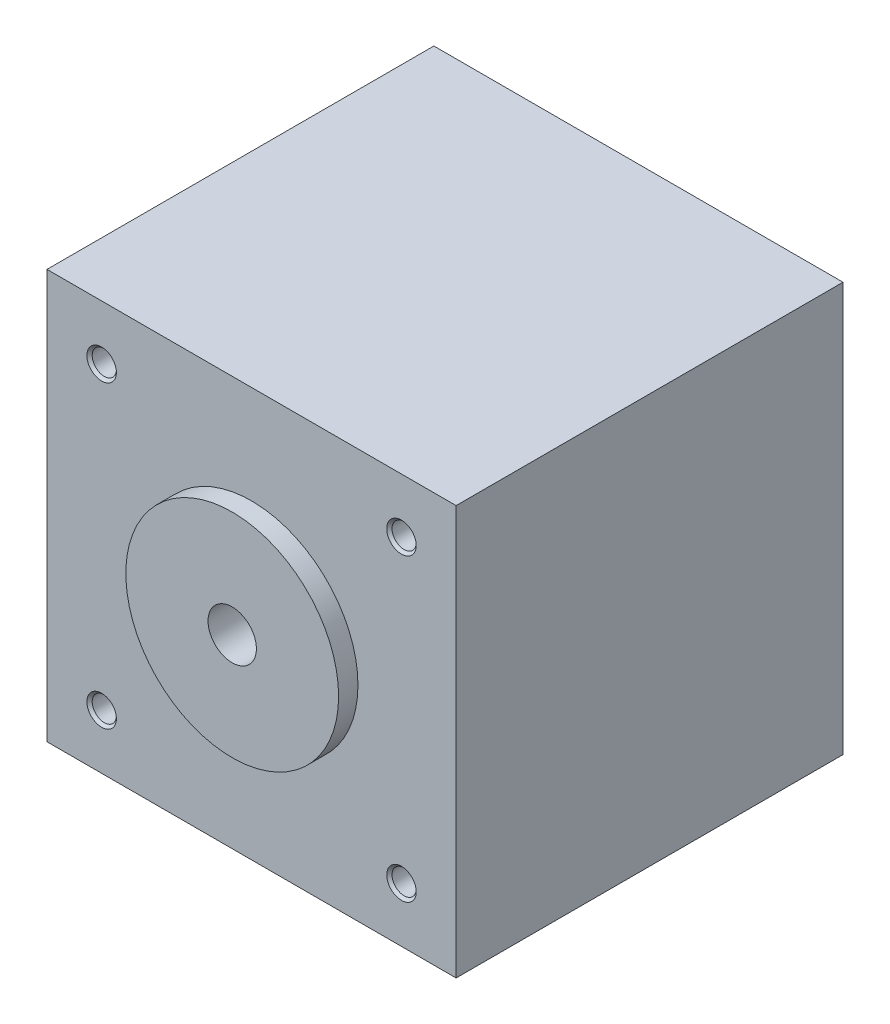
ISO-10303-21;
HEADER;
FILE_DESCRIPTION(('STEP AP214'),'2;1');
FILE_NAME('part.step','',(''),(''),'','','');
FILE_SCHEMA(('AUTOMOTIVE_DESIGN { 1 0 10303 214 1 1 1 1 }'));
ENDSEC;
DATA;
#1=APPLICATION_CONTEXT('core data for automotive mechanical design processes');
#2=APPLICATION_PROTOCOL_DEFINITION('international standard','automotive_design',2000,#1);
#3=PRODUCT_CONTEXT('',#1,'mechanical');
#4=PRODUCT('Part','Part','',(#3));
#5=PRODUCT_RELATED_PRODUCT_CATEGORY('part','',(#4));
#6=PRODUCT_DEFINITION_FORMATION('','',#4);
#7=PRODUCT_DEFINITION_CONTEXT('part definition',#1,'design');
#8=PRODUCT_DEFINITION('design','',#6,#7);
#9=PRODUCT_DEFINITION_SHAPE('','',#8);
#10=(LENGTH_UNIT() NAMED_UNIT(*) SI_UNIT(.MILLI.,.METRE.));
#11=(NAMED_UNIT(*) PLANE_ANGLE_UNIT() SI_UNIT($,.RADIAN.));
#12=(NAMED_UNIT(*) SI_UNIT($,.STERADIAN.) SOLID_ANGLE_UNIT());
#13=UNCERTAINTY_MEASURE_WITH_UNIT(LENGTH_MEASURE(1.E-05),#10,'distance_accuracy_value','');
#14=(GEOMETRIC_REPRESENTATION_CONTEXT(3) GLOBAL_UNCERTAINTY_ASSIGNED_CONTEXT((#13)) GLOBAL_UNIT_ASSIGNED_CONTEXT((#10,
#11,#12)) REPRESENTATION_CONTEXT('',''));
#15=CARTESIAN_POINT('',(0.,0.,0.));
#16=DIRECTION('',(0.,0.,1.));
#17=DIRECTION('',(1.,0.,0.));
#18=AXIS2_PLACEMENT_3D('',#15,#16,#17);
#19=CARTESIAN_POINT('',(21.15,21.15,40.));
#20=DIRECTION('',(-1.,0.,0.));
#21=DIRECTION('',(0.,-1.,0.));
#22=AXIS2_PLACEMENT_3D('',#19,#20,#21);
#23=PLANE('',#22);
#24=DIRECTION('',(0.,1.,0.));
#25=VECTOR('',#24,1.);
#26=CARTESIAN_POINT('',(21.15,21.15,0.));
#27=LINE('',#26,#25);
#28=CARTESIAN_POINT('',(21.15,-21.15,0.));
#29=VERTEX_POINT('',#28);
#30=CARTESIAN_POINT('',(21.15,21.15,0.));
#31=VERTEX_POINT('',#30);
#32=EDGE_CURVE('E165',#29,#31,#27,.T.);
#33=ORIENTED_EDGE('',*,*,#32,.T.);
#34=DIRECTION('',(0.,0.,-1.));
#35=VECTOR('',#34,1.);
#36=CARTESIAN_POINT('',(21.15,21.15,40.));
#37=LINE('',#36,#35);
#38=CARTESIAN_POINT('',(21.15,21.15,40.));
#39=VERTEX_POINT('',#38);
#40=EDGE_CURVE('E11',#39,#31,#37,.T.);
#41=ORIENTED_EDGE('',*,*,#40,.F.);
#42=DIRECTION('',(0.,1.,0.));
#43=VECTOR('',#42,1.);
#44=CARTESIAN_POINT('',(21.15,21.15,40.));
#45=LINE('',#44,#43);
#46=CARTESIAN_POINT('',(21.15,-21.15,40.));
#47=VERTEX_POINT('',#46);
#48=EDGE_CURVE('E166',#47,#39,#45,.T.);
#49=ORIENTED_EDGE('',*,*,#48,.F.);
#50=DIRECTION('',(0.,0.,-1.));
#51=VECTOR('',#50,1.);
#52=CARTESIAN_POINT('',(21.15,-21.15,40.));
#53=LINE('',#52,#51);
#54=EDGE_CURVE('E176',#47,#29,#53,.T.);
#55=ORIENTED_EDGE('',*,*,#54,.T.);
#56=EDGE_LOOP('',(#33,#41,#49,#55));
#57=FACE_BOUND('',#56,.T.);
#58=ADVANCED_FACE('F49',(#57),#23,.F.);
#59=CARTESIAN_POINT('',(-21.15,21.15,40.));
#60=DIRECTION('',(0.,-1.,0.));
#61=DIRECTION('',(0.,0.,-1.));
#62=AXIS2_PLACEMENT_3D('',#59,#60,#61);
#63=PLANE('',#62);
#64=DIRECTION('',(-1.,0.,0.));
#65=VECTOR('',#64,1.);
#66=CARTESIAN_POINT('',(-21.15,21.15,0.));
#67=LINE('',#66,#65);
#68=CARTESIAN_POINT('',(-21.15,21.15,0.));
#69=VERTEX_POINT('',#68);
#70=EDGE_CURVE('E180',#31,#69,#67,.T.);
#71=ORIENTED_EDGE('',*,*,#70,.T.);
#72=DIRECTION('',(0.,0.,-1.));
#73=VECTOR('',#72,1.);
#74=CARTESIAN_POINT('',(-21.15,21.15,40.));
#75=LINE('',#74,#73);
#76=CARTESIAN_POINT('',(-21.15,21.15,40.));
#77=VERTEX_POINT('',#76);
#78=EDGE_CURVE('E58',#77,#69,#75,.T.);
#79=ORIENTED_EDGE('',*,*,#78,.F.);
#80=DIRECTION('',(-1.,0.,0.));
#81=VECTOR('',#80,1.);
#82=CARTESIAN_POINT('',(-21.15,21.15,40.));
#83=LINE('',#82,#81);
#84=EDGE_CURVE('E97',#39,#77,#83,.T.);
#85=ORIENTED_EDGE('',*,*,#84,.F.);
#86=ORIENTED_EDGE('',*,*,#40,.T.);
#87=EDGE_LOOP('',(#71,#79,#85,#86));
#88=FACE_BOUND('',#87,.T.);
#89=ADVANCED_FACE('F210',(#88),#63,.F.);
#90=CARTESIAN_POINT('',(-21.15,21.15,40.));
#91=DIRECTION('',(1.,0.,0.));
#92=DIRECTION('',(0.,1.,0.));
#93=AXIS2_PLACEMENT_3D('',#90,#91,#92);
#94=PLANE('',#93);
#95=DIRECTION('',(0.,-1.,0.));
#96=VECTOR('',#95,1.);
#97=CARTESIAN_POINT('',(-21.15,21.15,0.));
#98=LINE('',#97,#96);
#99=CARTESIAN_POINT('',(-21.15,-21.15,0.));
#100=VERTEX_POINT('',#99);
#101=EDGE_CURVE('E84',#69,#100,#98,.T.);
#102=ORIENTED_EDGE('',*,*,#101,.T.);
#103=DIRECTION('',(0.,0.,-1.));
#104=VECTOR('',#103,1.);
#105=CARTESIAN_POINT('',(-21.15,-21.15,40.));
#106=LINE('',#105,#104);
#107=CARTESIAN_POINT('',(-21.15,-21.15,40.));
#108=VERTEX_POINT('',#107);
#109=EDGE_CURVE('E189',#108,#100,#106,.T.);
#110=ORIENTED_EDGE('',*,*,#109,.F.);
#111=DIRECTION('',(0.,-1.,0.));
#112=VECTOR('',#111,1.);
#113=CARTESIAN_POINT('',(-21.15,21.15,40.));
#114=LINE('',#113,#112);
#115=EDGE_CURVE('E171',#77,#108,#114,.T.);
#116=ORIENTED_EDGE('',*,*,#115,.F.);
#117=ORIENTED_EDGE('',*,*,#78,.T.);
#118=EDGE_LOOP('',(#102,#110,#116,#117));
#119=FACE_BOUND('',#118,.T.);
#120=ADVANCED_FACE('F193',(#119),#94,.F.);
#121=CARTESIAN_POINT('',(-21.15,-21.15,40.));
#122=DIRECTION('',(0.,1.,0.));
#123=DIRECTION('',(0.,0.,1.));
#124=AXIS2_PLACEMENT_3D('',#121,#122,#123);
#125=PLANE('',#124);
#126=DIRECTION('',(1.,0.,0.));
#127=VECTOR('',#126,1.);
#128=CARTESIAN_POINT('',(-21.15,-21.15,0.));
#129=LINE('',#128,#127);
#130=EDGE_CURVE('E90',#100,#29,#129,.T.);
#131=ORIENTED_EDGE('',*,*,#130,.T.);
#132=ORIENTED_EDGE('',*,*,#54,.F.);
#133=DIRECTION('',(1.,0.,0.));
#134=VECTOR('',#133,1.);
#135=CARTESIAN_POINT('',(-21.15,-21.15,40.));
#136=LINE('',#135,#134);
#137=EDGE_CURVE('E66',#108,#47,#136,.T.);
#138=ORIENTED_EDGE('',*,*,#137,.F.);
#139=ORIENTED_EDGE('',*,*,#109,.T.);
#140=EDGE_LOOP('',(#131,#132,#138,#139));
#141=FACE_BOUND('',#140,.T.);
#142=ADVANCED_FACE('F200',(#141),#125,.F.);
#143=CARTESIAN_POINT('',(0.,0.,40.));
#144=DIRECTION('',(0.,0.,1.));
#145=DIRECTION('',(1.,0.,0.));
#146=AXIS2_PLACEMENT_3D('',#143,#144,#145);
#147=PLANE('',#146);
#148=CARTESIAN_POINT('',(0.,0.,40.));
#149=DIRECTION('',(0.,0.,1.));
#150=DIRECTION('',(1.,0.,0.));
#151=AXIS2_PLACEMENT_3D('',#148,#149,#150);
#152=CIRCLE('',#151,11.);
#153=CARTESIAN_POINT('',(11.,0.,40.));
#154=VERTEX_POINT('',#153);
#155=EDGE_CURVE('E525',#154,#154,#152,.T.);
#156=ORIENTED_EDGE('',*,*,#155,.F.);
#157=EDGE_LOOP('',(#156));
#158=FACE_BOUND('',#157,.T.);
#159=CARTESIAN_POINT('',(-15.5,15.5,40.));
#160=DIRECTION('',(0.,0.,1.));
#161=DIRECTION('',(1.,0.,0.));
#162=AXIS2_PLACEMENT_3D('',#159,#160,#161);
#163=CIRCLE('',#162,1.525);
#164=CARTESIAN_POINT('',(-13.975,15.5,40.));
#165=VERTEX_POINT('',#164);
#166=EDGE_CURVE('E130',#165,#165,#163,.T.);
#167=ORIENTED_EDGE('',*,*,#166,.F.);
#168=EDGE_LOOP('',(#167));
#169=FACE_BOUND('',#168,.T.);
#170=CARTESIAN_POINT('',(15.5,15.5,40.));
#171=DIRECTION('',(0.,0.,1.));
#172=DIRECTION('',(1.,0.,0.));
#173=AXIS2_PLACEMENT_3D('',#170,#171,#172);
#174=CIRCLE('',#173,1.525);
#175=CARTESIAN_POINT('',(17.025,15.5,40.));
#176=VERTEX_POINT('',#175);
#177=EDGE_CURVE('E121',#176,#176,#174,.T.);
#178=ORIENTED_EDGE('',*,*,#177,.F.);
#179=EDGE_LOOP('',(#178));
#180=FACE_BOUND('',#179,.T.);
#181=CARTESIAN_POINT('',(15.5,-15.5,40.));
#182=DIRECTION('',(0.,0.,1.));
#183=DIRECTION('',(1.,0.,0.));
#184=AXIS2_PLACEMENT_3D('',#181,#182,#183);
#185=CIRCLE('',#184,1.525);
#186=CARTESIAN_POINT('',(17.025,-15.5,40.));
#187=VERTEX_POINT('',#186);
#188=EDGE_CURVE('E141',#187,#187,#185,.T.);
#189=ORIENTED_EDGE('',*,*,#188,.F.);
#190=EDGE_LOOP('',(#189));
#191=FACE_BOUND('',#190,.T.);
#192=CARTESIAN_POINT('',(-15.5,-15.5,40.));
#193=DIRECTION('',(0.,0.,1.));
#194=DIRECTION('',(1.,0.,0.));
#195=AXIS2_PLACEMENT_3D('',#192,#193,#194);
#196=CIRCLE('',#195,1.525);
#197=CARTESIAN_POINT('',(-13.975,-15.5,40.));
#198=VERTEX_POINT('',#197);
#199=EDGE_CURVE('E153',#198,#198,#196,.T.);
#200=ORIENTED_EDGE('',*,*,#199,.F.);
#201=EDGE_LOOP('',(#200));
#202=FACE_BOUND('',#201,.T.);
#203=ORIENTED_EDGE('',*,*,#48,.T.);
#204=ORIENTED_EDGE('',*,*,#84,.T.);
#205=ORIENTED_EDGE('',*,*,#115,.T.);
#206=ORIENTED_EDGE('',*,*,#137,.T.);
#207=EDGE_LOOP('',(#203,#204,#205,#206));
#208=FACE_BOUND('',#207,.T.);
#209=ADVANCED_FACE('F202',(#158,#169,#180,#191,#202,#208),#147,.T.);
#210=CARTESIAN_POINT('',(0.,0.,0.));
#211=DIRECTION('',(0.,0.,1.));
#212=DIRECTION('',(1.,0.,0.));
#213=AXIS2_PLACEMENT_3D('',#210,#211,#212);
#214=PLANE('',#213);
#215=CARTESIAN_POINT('',(0.,0.,0.));
#216=DIRECTION('',(0.,0.,1.));
#217=DIRECTION('',(1.,0.,0.));
#218=AXIS2_PLACEMENT_3D('',#215,#216,#217);
#219=CIRCLE('',#218,11.);
#220=CARTESIAN_POINT('',(11.,0.,0.));
#221=VERTEX_POINT('',#220);
#222=EDGE_CURVE('E518',#221,#221,#219,.T.);
#223=ORIENTED_EDGE('',*,*,#222,.T.);
#224=EDGE_LOOP('',(#223));
#225=FACE_BOUND('',#224,.T.);
#226=ORIENTED_EDGE('',*,*,#32,.F.);
#227=ORIENTED_EDGE('',*,*,#130,.F.);
#228=ORIENTED_EDGE('',*,*,#101,.F.);
#229=ORIENTED_EDGE('',*,*,#70,.F.);
#230=EDGE_LOOP('',(#226,#227,#228,#229));
#231=FACE_BOUND('',#230,.T.);
#232=ADVANCED_FACE('F196',(#225,#231),#214,.F.);
#233=CARTESIAN_POINT('',(-15.5,-15.5,31.5));
#234=DIRECTION('',(0.,0.,1.));
#235=DIRECTION('',(1.,0.,0.));
#236=AXIS2_PLACEMENT_3D('',#233,#234,#235);
#237=CONICAL_SURFACE('',#236,1.25,1.02974425867665);
#238=CARTESIAN_POINT('',(-15.5,-15.5,30.7489242262155));
#239=VERTEX_POINT('',#238);
#240=VERTEX_LOOP('',#239);
#241=FACE_BOUND('',#240,.T.);
#242=CARTESIAN_POINT('',(-15.5,-15.5,31.5));
#243=DIRECTION('',(0.,0.,1.));
#244=DIRECTION('',(1.,0.,0.));
#245=AXIS2_PLACEMENT_3D('',#242,#243,#244);
#246=CIRCLE('',#245,1.25);
#247=CARTESIAN_POINT('',(-14.25,-15.5,31.5));
#248=VERTEX_POINT('',#247);
#249=EDGE_CURVE('E161',#248,#248,#246,.T.);
#250=ORIENTED_EDGE('',*,*,#249,.T.);
#251=EDGE_LOOP('',(#250));
#252=FACE_BOUND('',#251,.T.);
#253=ADVANCED_FACE('F235',(#241,#252),#237,.F.);
#254=CARTESIAN_POINT('',(-15.5,-15.5,40.));
#255=DIRECTION('',(0.,0.,1.));
#256=DIRECTION('',(1.,0.,0.));
#257=AXIS2_PLACEMENT_3D('',#254,#255,#256);
#258=CYLINDRICAL_SURFACE('',#257,1.25);
#259=ORIENTED_EDGE('',*,*,#249,.F.);
#260=EDGE_LOOP('',(#259));
#261=FACE_BOUND('',#260,.T.);
#262=CARTESIAN_POINT('',(-15.5,-15.5,39.725));
#263=DIRECTION('',(0.,0.,1.));
#264=DIRECTION('',(1.,0.,0.));
#265=AXIS2_PLACEMENT_3D('',#262,#263,#264);
#266=CIRCLE('',#265,1.25);
#267=CARTESIAN_POINT('',(-14.25,-15.5,39.725));
#268=VERTEX_POINT('',#267);
#269=EDGE_CURVE('E157',#268,#268,#266,.T.);
#270=ORIENTED_EDGE('',*,*,#269,.T.);
#271=EDGE_LOOP('',(#270));
#272=FACE_BOUND('',#271,.T.);
#273=ADVANCED_FACE('F240',(#261,#272),#258,.F.);
#274=CARTESIAN_POINT('',(-15.5,-15.5,40.));
#275=DIRECTION('',(0.,0.,1.));
#276=DIRECTION('',(1.,0.,0.));
#277=AXIS2_PLACEMENT_3D('',#274,#275,#276);
#278=CONICAL_SURFACE('',#277,1.525,0.785398163397442);
#279=ORIENTED_EDGE('',*,*,#269,.F.);
#280=EDGE_LOOP('',(#279));
#281=FACE_BOUND('',#280,.T.);
#282=ORIENTED_EDGE('',*,*,#199,.T.);
#283=EDGE_LOOP('',(#282));
#284=FACE_BOUND('',#283,.T.);
#285=ADVANCED_FACE('F254',(#281,#284),#278,.F.);
#286=CARTESIAN_POINT('',(15.5,-15.5,31.5));
#287=DIRECTION('',(0.,0.,1.));
#288=DIRECTION('',(1.,0.,0.));
#289=AXIS2_PLACEMENT_3D('',#286,#287,#288);
#290=CONICAL_SURFACE('',#289,1.25,1.02974425867665);
#291=CARTESIAN_POINT('',(15.5,-15.5,30.7489242262155));
#292=VERTEX_POINT('',#291);
#293=VERTEX_LOOP('',#292);
#294=FACE_BOUND('',#293,.T.);
#295=CARTESIAN_POINT('',(15.5,-15.5,31.5));
#296=DIRECTION('',(0.,0.,1.));
#297=DIRECTION('',(1.,0.,0.));
#298=AXIS2_PLACEMENT_3D('',#295,#296,#297);
#299=CIRCLE('',#298,1.25);
#300=CARTESIAN_POINT('',(16.75,-15.5,31.5));
#301=VERTEX_POINT('',#300);
#302=EDGE_CURVE('E149',#301,#301,#299,.T.);
#303=ORIENTED_EDGE('',*,*,#302,.T.);
#304=EDGE_LOOP('',(#303));
#305=FACE_BOUND('',#304,.T.);
#306=ADVANCED_FACE('F268',(#294,#305),#290,.F.);
#307=CARTESIAN_POINT('',(15.5,-15.5,40.));
#308=DIRECTION('',(0.,0.,1.));
#309=DIRECTION('',(1.,0.,0.));
#310=AXIS2_PLACEMENT_3D('',#307,#308,#309);
#311=CYLINDRICAL_SURFACE('',#310,1.25);
#312=ORIENTED_EDGE('',*,*,#302,.F.);
#313=EDGE_LOOP('',(#312));
#314=FACE_BOUND('',#313,.T.);
#315=CARTESIAN_POINT('',(15.5,-15.5,39.725));
#316=DIRECTION('',(0.,0.,1.));
#317=DIRECTION('',(1.,0.,0.));
#318=AXIS2_PLACEMENT_3D('',#315,#316,#317);
#319=CIRCLE('',#318,1.25);
#320=CARTESIAN_POINT('',(16.75,-15.5,39.725));
#321=VERTEX_POINT('',#320);
#322=EDGE_CURVE('E145',#321,#321,#319,.T.);
#323=ORIENTED_EDGE('',*,*,#322,.T.);
#324=EDGE_LOOP('',(#323));
#325=FACE_BOUND('',#324,.T.);
#326=ADVANCED_FACE('F281',(#314,#325),#311,.F.);
#327=CARTESIAN_POINT('',(15.5,-15.5,40.));
#328=DIRECTION('',(0.,0.,1.));
#329=DIRECTION('',(1.,0.,0.));
#330=AXIS2_PLACEMENT_3D('',#327,#328,#329);
#331=CONICAL_SURFACE('',#330,1.525,0.785398163397442);
#332=ORIENTED_EDGE('',*,*,#322,.F.);
#333=EDGE_LOOP('',(#332));
#334=FACE_BOUND('',#333,.T.);
#335=ORIENTED_EDGE('',*,*,#188,.T.);
#336=EDGE_LOOP('',(#335));
#337=FACE_BOUND('',#336,.T.);
#338=ADVANCED_FACE('F292',(#334,#337),#331,.F.);
#339=CARTESIAN_POINT('',(15.5,15.5,31.5));
#340=DIRECTION('',(0.,0.,1.));
#341=DIRECTION('',(1.,0.,0.));
#342=AXIS2_PLACEMENT_3D('',#339,#340,#341);
#343=CONICAL_SURFACE('',#342,1.25,1.02974425867665);
#344=CARTESIAN_POINT('',(15.5,15.5,30.7489242262155));
#345=VERTEX_POINT('',#344);
#346=VERTEX_LOOP('',#345);
#347=FACE_BOUND('',#346,.T.);
#348=CARTESIAN_POINT('',(15.5,15.5,31.5));
#349=DIRECTION('',(0.,0.,1.));
#350=DIRECTION('',(1.,0.,0.));
#351=AXIS2_PLACEMENT_3D('',#348,#349,#350);
#352=CIRCLE('',#351,1.25);
#353=CARTESIAN_POINT('',(16.75,15.5,31.5));
#354=VERTEX_POINT('',#353);
#355=EDGE_CURVE('E137',#354,#354,#352,.T.);
#356=ORIENTED_EDGE('',*,*,#355,.T.);
#357=EDGE_LOOP('',(#356));
#358=FACE_BOUND('',#357,.T.);
#359=ADVANCED_FACE('F306',(#347,#358),#343,.F.);
#360=CARTESIAN_POINT('',(15.5,15.5,40.));
#361=DIRECTION('',(0.,0.,1.));
#362=DIRECTION('',(1.,0.,0.));
#363=AXIS2_PLACEMENT_3D('',#360,#361,#362);
#364=CYLINDRICAL_SURFACE('',#363,1.25);
#365=ORIENTED_EDGE('',*,*,#355,.F.);
#366=EDGE_LOOP('',(#365));
#367=FACE_BOUND('',#366,.T.);
#368=CARTESIAN_POINT('',(15.5,15.5,39.725));
#369=DIRECTION('',(0.,0.,1.));
#370=DIRECTION('',(1.,0.,0.));
#371=AXIS2_PLACEMENT_3D('',#368,#369,#370);
#372=CIRCLE('',#371,1.25);
#373=CARTESIAN_POINT('',(16.75,15.5,39.725));
#374=VERTEX_POINT('',#373);
#375=EDGE_CURVE('E127',#374,#374,#372,.T.);
#376=ORIENTED_EDGE('',*,*,#375,.T.);
#377=EDGE_LOOP('',(#376));
#378=FACE_BOUND('',#377,.T.);
#379=ADVANCED_FACE('F319',(#367,#378),#364,.F.);
#380=CARTESIAN_POINT('',(15.5,15.5,40.));
#381=DIRECTION('',(0.,0.,1.));
#382=DIRECTION('',(1.,0.,0.));
#383=AXIS2_PLACEMENT_3D('',#380,#381,#382);
#384=CONICAL_SURFACE('',#383,1.525,0.785398163397442);
#385=ORIENTED_EDGE('',*,*,#375,.F.);
#386=EDGE_LOOP('',(#385));
#387=FACE_BOUND('',#386,.T.);
#388=ORIENTED_EDGE('',*,*,#177,.T.);
#389=EDGE_LOOP('',(#388));
#390=FACE_BOUND('',#389,.T.);
#391=ADVANCED_FACE('F114',(#387,#390),#384,.F.);
#392=CARTESIAN_POINT('',(-15.5,15.5,31.5));
#393=DIRECTION('',(0.,0.,1.));
#394=DIRECTION('',(1.,0.,0.));
#395=AXIS2_PLACEMENT_3D('',#392,#393,#394);
#396=CONICAL_SURFACE('',#395,1.25,1.02974425867665);
#397=CARTESIAN_POINT('',(-15.5,15.5,30.7489242262155));
#398=VERTEX_POINT('',#397);
#399=VERTEX_LOOP('',#398);
#400=FACE_BOUND('',#399,.T.);
#401=CARTESIAN_POINT('',(-15.5,15.5,31.5));
#402=DIRECTION('',(0.,0.,1.));
#403=DIRECTION('',(1.,0.,0.));
#404=AXIS2_PLACEMENT_3D('',#401,#402,#403);
#405=CIRCLE('',#404,1.25);
#406=CARTESIAN_POINT('',(-14.25,15.5,31.5));
#407=VERTEX_POINT('',#406);
#408=EDGE_CURVE('E118',#407,#407,#405,.T.);
#409=ORIENTED_EDGE('',*,*,#408,.T.);
#410=EDGE_LOOP('',(#409));
#411=FACE_BOUND('',#410,.T.);
#412=ADVANCED_FACE('F110',(#400,#411),#396,.F.);
#413=CARTESIAN_POINT('',(-15.5,15.5,40.));
#414=DIRECTION('',(0.,0.,1.));
#415=DIRECTION('',(1.,0.,0.));
#416=AXIS2_PLACEMENT_3D('',#413,#414,#415);
#417=CYLINDRICAL_SURFACE('',#416,1.25);
#418=ORIENTED_EDGE('',*,*,#408,.F.);
#419=EDGE_LOOP('',(#418));
#420=FACE_BOUND('',#419,.T.);
#421=CARTESIAN_POINT('',(-15.5,15.5,39.725));
#422=DIRECTION('',(0.,0.,1.));
#423=DIRECTION('',(1.,0.,0.));
#424=AXIS2_PLACEMENT_3D('',#421,#422,#423);
#425=CIRCLE('',#424,1.25);
#426=CARTESIAN_POINT('',(-14.25,15.5,39.725));
#427=VERTEX_POINT('',#426);
#428=EDGE_CURVE('E122',#427,#427,#425,.T.);
#429=ORIENTED_EDGE('',*,*,#428,.T.);
#430=EDGE_LOOP('',(#429));
#431=FACE_BOUND('',#430,.T.);
#432=ADVANCED_FACE('F113',(#420,#431),#417,.F.);
#433=CARTESIAN_POINT('',(-15.5,15.5,40.));
#434=DIRECTION('',(0.,0.,1.));
#435=DIRECTION('',(1.,0.,0.));
#436=AXIS2_PLACEMENT_3D('',#433,#434,#435);
#437=CONICAL_SURFACE('',#436,1.525,0.785398163397442);
#438=ORIENTED_EDGE('',*,*,#428,.F.);
#439=EDGE_LOOP('',(#438));
#440=FACE_BOUND('',#439,.T.);
#441=ORIENTED_EDGE('',*,*,#166,.T.);
#442=EDGE_LOOP('',(#441));
#443=FACE_BOUND('',#442,.T.);
#444=ADVANCED_FACE('F362',(#440,#443),#437,.F.);
#445=CARTESIAN_POINT('',(0.,0.,42.));
#446=DIRECTION('',(0.,0.,-1.));
#447=DIRECTION('',(-1.,0.,0.));
#448=AXIS2_PLACEMENT_3D('',#445,#446,#447);
#449=CYLINDRICAL_SURFACE('',#448,11.);
#450=CARTESIAN_POINT('',(0.,0.,42.));
#451=DIRECTION('',(0.,0.,1.));
#452=DIRECTION('',(1.,0.,0.));
#453=AXIS2_PLACEMENT_3D('',#450,#451,#452);
#454=CIRCLE('',#453,11.);
#455=CARTESIAN_POINT('',(11.,0.,42.));
#456=VERTEX_POINT('',#455);
#457=EDGE_CURVE('E529',#456,#456,#454,.T.);
#458=ORIENTED_EDGE('',*,*,#457,.F.);
#459=EDGE_LOOP('',(#458));
#460=FACE_BOUND('',#459,.T.);
#461=ORIENTED_EDGE('',*,*,#155,.T.);
#462=EDGE_LOOP('',(#461));
#463=FACE_BOUND('',#462,.T.);
#464=ADVANCED_FACE('F374',(#460,#463),#449,.T.);
#465=CARTESIAN_POINT('',(0.,0.,42.));
#466=DIRECTION('',(0.,0.,1.));
#467=DIRECTION('',(1.,0.,0.));
#468=AXIS2_PLACEMENT_3D('',#465,#466,#467);
#469=PLANE('',#468);
#470=CARTESIAN_POINT('',(0.,0.,42.));
#471=DIRECTION('',(0.,0.,1.));
#472=DIRECTION('',(1.,0.,0.));
#473=AXIS2_PLACEMENT_3D('',#470,#471,#472);
#474=CIRCLE('',#473,2.5);
#475=CARTESIAN_POINT('',(2.5,0.,42.));
#476=VERTEX_POINT('',#475);
#477=EDGE_CURVE('E514',#476,#476,#474,.T.);
#478=ORIENTED_EDGE('',*,*,#477,.F.);
#479=EDGE_LOOP('',(#478));
#480=FACE_BOUND('',#479,.T.);
#481=ORIENTED_EDGE('',*,*,#457,.T.);
#482=EDGE_LOOP('',(#481));
#483=FACE_BOUND('',#482,.T.);
#484=ADVANCED_FACE('F392',(#480,#483),#469,.T.);
#485=CARTESIAN_POINT('',(0.,0.,-2.));
#486=DIRECTION('',(0.,0.,1.));
#487=DIRECTION('',(1.,0.,0.));
#488=AXIS2_PLACEMENT_3D('',#485,#486,#487);
#489=CYLINDRICAL_SURFACE('',#488,11.);
#490=CARTESIAN_POINT('',(0.,0.,-2.));
#491=DIRECTION('',(0.,0.,1.));
#492=DIRECTION('',(1.,0.,0.));
#493=AXIS2_PLACEMENT_3D('',#490,#491,#492);
#494=CIRCLE('',#493,11.);
#495=CARTESIAN_POINT('',(11.,0.,-2.));
#496=VERTEX_POINT('',#495);
#497=EDGE_CURVE('E521',#496,#496,#494,.T.);
#498=ORIENTED_EDGE('',*,*,#497,.T.);
#499=EDGE_LOOP('',(#498));
#500=FACE_BOUND('',#499,.T.);
#501=ORIENTED_EDGE('',*,*,#222,.F.);
#502=EDGE_LOOP('',(#501));
#503=FACE_BOUND('',#502,.T.);
#504=ADVANCED_FACE('F408',(#500,#503),#489,.T.);
#505=CARTESIAN_POINT('',(0.,0.,-2.));
#506=DIRECTION('',(0.,0.,-1.));
#507=DIRECTION('',(1.,0.,0.));
#508=AXIS2_PLACEMENT_3D('',#505,#506,#507);
#509=PLANE('',#508);
#510=CARTESIAN_POINT('',(0.,0.,-2.));
#511=DIRECTION('',(0.,0.,1.));
#512=DIRECTION('',(1.,0.,0.));
#513=AXIS2_PLACEMENT_3D('',#510,#511,#512);
#514=CIRCLE('',#513,2.5);
#515=CARTESIAN_POINT('',(2.5,0.,-2.));
#516=VERTEX_POINT('',#515);
#517=EDGE_CURVE('E511',#516,#516,#514,.T.);
#518=ORIENTED_EDGE('',*,*,#517,.T.);
#519=EDGE_LOOP('',(#518));
#520=FACE_BOUND('',#519,.T.);
#521=ORIENTED_EDGE('',*,*,#497,.F.);
#522=EDGE_LOOP('',(#521));
#523=FACE_BOUND('',#522,.T.);
#524=ADVANCED_FACE('F413',(#520,#523),#509,.T.);
#525=CARTESIAN_POINT('',(0.,0.,-2.));
#526=DIRECTION('',(0.,0.,1.));
#527=DIRECTION('',(1.,0.,0.));
#528=AXIS2_PLACEMENT_3D('',#525,#526,#527);
#529=CYLINDRICAL_SURFACE('',#528,2.5);
#530=ORIENTED_EDGE('',*,*,#517,.F.);
#531=EDGE_LOOP('',(#530));
#532=FACE_BOUND('',#531,.T.);
#533=ORIENTED_EDGE('',*,*,#477,.T.);
#534=EDGE_LOOP('',(#533));
#535=FACE_BOUND('',#534,.T.);
#536=ADVANCED_FACE('F432',(#532,#535),#529,.F.);
#537=CLOSED_SHELL('',(#58,#89,#120,#142,#209,#232,#253,#273,#285,#306,#326,#338,#359,#379,#391,
#412,#432,#444,#464,#484,#504,#524,#536));
#538=MANIFOLD_SOLID_BREP('B2',#537);
#539=ADVANCED_BREP_SHAPE_REPRESENTATION('',(#18,#538),#14);
#540=SHAPE_DEFINITION_REPRESENTATION(#9,#539);
ENDSEC;
END-ISO-10303-21;
